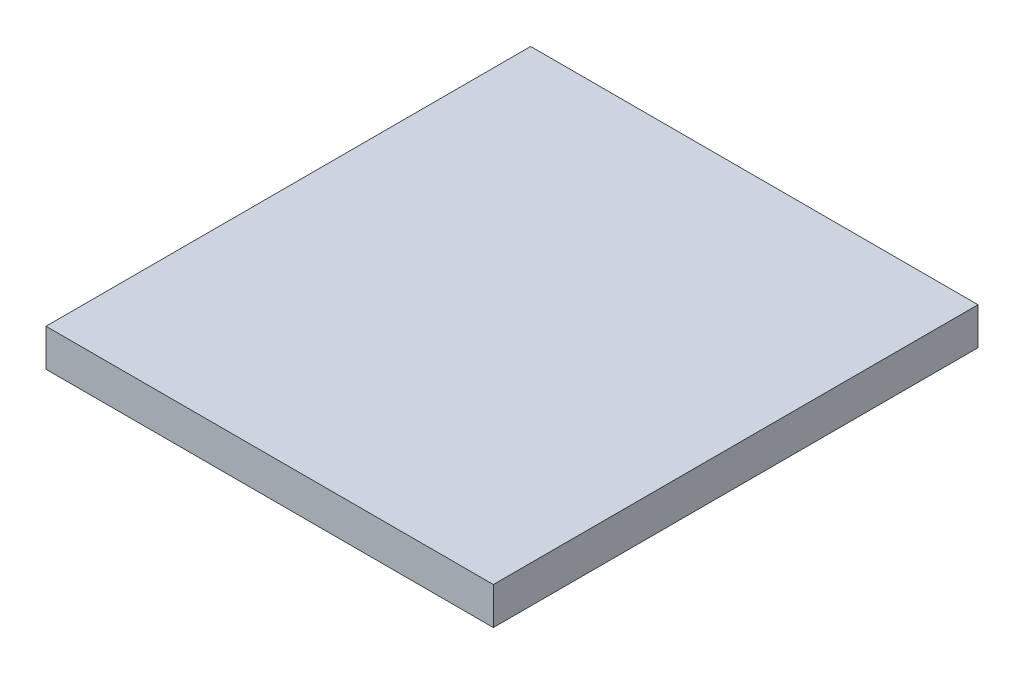
ISO-10303-21;
HEADER;
FILE_DESCRIPTION(('STEP AP214'),'2;1');
FILE_NAME('part.step','',(''),(''),'','','');
FILE_SCHEMA(('AUTOMOTIVE_DESIGN { 1 0 10303 214 1 1 1 1 }'));
ENDSEC;
DATA;
#1=APPLICATION_CONTEXT('core data for automotive mechanical design processes');
#2=APPLICATION_PROTOCOL_DEFINITION('international standard','automotive_design',2000,#1);
#3=PRODUCT_CONTEXT('',#1,'mechanical');
#4=PRODUCT('Part','Part','',(#3));
#5=PRODUCT_RELATED_PRODUCT_CATEGORY('part','',(#4));
#6=PRODUCT_DEFINITION_FORMATION('','',#4);
#7=PRODUCT_DEFINITION_CONTEXT('part definition',#1,'design');
#8=PRODUCT_DEFINITION('design','',#6,#7);
#9=PRODUCT_DEFINITION_SHAPE('','',#8);
#10=(LENGTH_UNIT() NAMED_UNIT(*) SI_UNIT(.MILLI.,.METRE.));
#11=(NAMED_UNIT(*) PLANE_ANGLE_UNIT() SI_UNIT($,.RADIAN.));
#12=(NAMED_UNIT(*) SI_UNIT($,.STERADIAN.) SOLID_ANGLE_UNIT());
#13=UNCERTAINTY_MEASURE_WITH_UNIT(LENGTH_MEASURE(1.E-05),#10,'distance_accuracy_value','');
#14=(GEOMETRIC_REPRESENTATION_CONTEXT(3) GLOBAL_UNCERTAINTY_ASSIGNED_CONTEXT((#13)) GLOBAL_UNIT_ASSIGNED_CONTEXT((#10,
#11,#12)) REPRESENTATION_CONTEXT('',''));
#15=CARTESIAN_POINT('',(0.,0.,0.));
#16=DIRECTION('',(0.,0.,1.));
#17=DIRECTION('',(1.,0.,0.));
#18=AXIS2_PLACEMENT_3D('',#15,#16,#17);
#19=CARTESIAN_POINT('',(-30.,30.,-90.));
#20=DIRECTION('',(-1.,0.,0.));
#21=DIRECTION('',(0.,0.,1.));
#22=AXIS2_PLACEMENT_3D('',#19,#20,#21);
#23=PLANE('',#22);
#24=DIRECTION('',(0.,-1.,0.));
#25=VECTOR('',#24,1.);
#26=CARTESIAN_POINT('',(-30.,30.,-25.));
#27=LINE('',#26,#25);
#28=CARTESIAN_POINT('',(-30.,35.,-25.));
#29=VERTEX_POINT('',#28);
#30=CARTESIAN_POINT('',(-30.,30.,-25.));
#31=VERTEX_POINT('',#30);
#32=EDGE_CURVE('E103',#29,#31,#27,.T.);
#33=ORIENTED_EDGE('',*,*,#32,.F.);
#34=DIRECTION('',(0.,0.,1.));
#35=VECTOR('',#34,1.);
#36=CARTESIAN_POINT('',(-30.,35.,-90.));
#37=LINE('',#36,#35);
#38=CARTESIAN_POINT('',(-30.,35.,-90.));
#39=VERTEX_POINT('',#38);
#40=EDGE_CURVE('E11',#39,#29,#37,.T.);
#41=ORIENTED_EDGE('',*,*,#40,.F.);
#42=DIRECTION('',(0.,-1.,0.));
#43=VECTOR('',#42,1.);
#44=CARTESIAN_POINT('',(-30.,30.,-90.));
#45=LINE('',#44,#43);
#46=CARTESIAN_POINT('',(-30.,30.,-90.));
#47=VERTEX_POINT('',#46);
#48=EDGE_CURVE('E97',#39,#47,#45,.T.);
#49=ORIENTED_EDGE('',*,*,#48,.T.);
#50=DIRECTION('',(0.,0.,1.));
#51=VECTOR('',#50,1.);
#52=CARTESIAN_POINT('',(-30.,30.,-90.));
#53=LINE('',#52,#51);
#54=EDGE_CURVE('E42',#47,#31,#53,.T.);
#55=ORIENTED_EDGE('',*,*,#54,.T.);
#56=EDGE_LOOP('',(#33,#41,#49,#55));
#57=FACE_BOUND('',#56,.T.);
#58=ADVANCED_FACE('F39',(#57),#23,.T.);
#59=CARTESIAN_POINT('',(-30.,35.,-90.));
#60=DIRECTION('',(0.,1.,0.));
#61=DIRECTION('',(0.,0.,1.));
#62=AXIS2_PLACEMENT_3D('',#59,#60,#61);
#63=PLANE('',#62);
#64=DIRECTION('',(-1.,0.,0.));
#65=VECTOR('',#64,1.);
#66=CARTESIAN_POINT('',(-30.,35.,-25.));
#67=LINE('',#66,#65);
#68=CARTESIAN_POINT('',(30.,35.,-25.));
#69=VERTEX_POINT('',#68);
#70=EDGE_CURVE('E99',#69,#29,#67,.T.);
#71=ORIENTED_EDGE('',*,*,#70,.F.);
#72=DIRECTION('',(0.,0.,1.));
#73=VECTOR('',#72,1.);
#74=CARTESIAN_POINT('',(30.,35.,-90.));
#75=LINE('',#74,#73);
#76=CARTESIAN_POINT('',(30.,35.,-90.));
#77=VERTEX_POINT('',#76);
#78=EDGE_CURVE('E48',#77,#69,#75,.T.);
#79=ORIENTED_EDGE('',*,*,#78,.F.);
#80=DIRECTION('',(-1.,0.,0.));
#81=VECTOR('',#80,1.);
#82=CARTESIAN_POINT('',(-30.,35.,-90.));
#83=LINE('',#82,#81);
#84=EDGE_CURVE('E94',#77,#39,#83,.T.);
#85=ORIENTED_EDGE('',*,*,#84,.T.);
#86=ORIENTED_EDGE('',*,*,#40,.T.);
#87=EDGE_LOOP('',(#71,#79,#85,#86));
#88=FACE_BOUND('',#87,.T.);
#89=ADVANCED_FACE('F113',(#88),#63,.T.);
#90=CARTESIAN_POINT('',(30.,30.,-90.));
#91=DIRECTION('',(1.,0.,0.));
#92=DIRECTION('',(0.,0.,-1.));
#93=AXIS2_PLACEMENT_3D('',#90,#91,#92);
#94=PLANE('',#93);
#95=DIRECTION('',(0.,1.,0.));
#96=VECTOR('',#95,1.);
#97=CARTESIAN_POINT('',(30.,30.,-25.));
#98=LINE('',#97,#96);
#99=CARTESIAN_POINT('',(30.,30.,-25.));
#100=VERTEX_POINT('',#99);
#101=EDGE_CURVE('E89',#100,#69,#98,.T.);
#102=ORIENTED_EDGE('',*,*,#101,.F.);
#103=DIRECTION('',(0.,0.,1.));
#104=VECTOR('',#103,1.);
#105=CARTESIAN_POINT('',(30.,30.,-90.));
#106=LINE('',#105,#104);
#107=CARTESIAN_POINT('',(30.,30.,-90.));
#108=VERTEX_POINT('',#107);
#109=EDGE_CURVE('E84',#108,#100,#106,.T.);
#110=ORIENTED_EDGE('',*,*,#109,.F.);
#111=DIRECTION('',(0.,1.,0.));
#112=VECTOR('',#111,1.);
#113=CARTESIAN_POINT('',(30.,30.,-90.));
#114=LINE('',#113,#112);
#115=EDGE_CURVE('E87',#108,#77,#114,.T.);
#116=ORIENTED_EDGE('',*,*,#115,.T.);
#117=ORIENTED_EDGE('',*,*,#78,.T.);
#118=EDGE_LOOP('',(#102,#110,#116,#117));
#119=FACE_BOUND('',#118,.T.);
#120=ADVANCED_FACE('F86',(#119),#94,.T.);
#121=CARTESIAN_POINT('',(-30.,30.,-90.));
#122=DIRECTION('',(0.,-1.,0.));
#123=DIRECTION('',(0.,0.,-1.));
#124=AXIS2_PLACEMENT_3D('',#121,#122,#123);
#125=PLANE('',#124);
#126=DIRECTION('',(1.,0.,0.));
#127=VECTOR('',#126,1.);
#128=CARTESIAN_POINT('',(-30.,30.,-25.));
#129=LINE('',#128,#127);
#130=EDGE_CURVE('E106',#31,#100,#129,.T.);
#131=ORIENTED_EDGE('',*,*,#130,.F.);
#132=ORIENTED_EDGE('',*,*,#54,.F.);
#133=DIRECTION('',(1.,0.,0.));
#134=VECTOR('',#133,1.);
#135=CARTESIAN_POINT('',(-30.,30.,-90.));
#136=LINE('',#135,#134);
#137=EDGE_CURVE('E93',#47,#108,#136,.T.);
#138=ORIENTED_EDGE('',*,*,#137,.T.);
#139=ORIENTED_EDGE('',*,*,#109,.T.);
#140=EDGE_LOOP('',(#131,#132,#138,#139));
#141=FACE_BOUND('',#140,.T.);
#142=ADVANCED_FACE('F96',(#141),#125,.T.);
#143=CARTESIAN_POINT('',(0.,0.,-90.));
#144=DIRECTION('',(0.,0.,-1.));
#145=DIRECTION('',(-1.,0.,0.));
#146=AXIS2_PLACEMENT_3D('',#143,#144,#145);
#147=PLANE('',#146);
#148=ORIENTED_EDGE('',*,*,#48,.F.);
#149=ORIENTED_EDGE('',*,*,#84,.F.);
#150=ORIENTED_EDGE('',*,*,#115,.F.);
#151=ORIENTED_EDGE('',*,*,#137,.F.);
#152=EDGE_LOOP('',(#148,#149,#150,#151));
#153=FACE_BOUND('',#152,.T.);
#154=ADVANCED_FACE('F92',(#153),#147,.T.);
#155=CARTESIAN_POINT('',(0.,0.,-25.));
#156=DIRECTION('',(0.,0.,-1.));
#157=DIRECTION('',(-1.,0.,0.));
#158=AXIS2_PLACEMENT_3D('',#155,#156,#157);
#159=PLANE('',#158);
#160=ORIENTED_EDGE('',*,*,#32,.T.);
#161=ORIENTED_EDGE('',*,*,#130,.T.);
#162=ORIENTED_EDGE('',*,*,#101,.T.);
#163=ORIENTED_EDGE('',*,*,#70,.T.);
#164=EDGE_LOOP('',(#160,#161,#162,#163));
#165=FACE_BOUND('',#164,.T.);
#166=ADVANCED_FACE('F112',(#165),#159,.F.);
#167=CLOSED_SHELL('',(#58,#89,#120,#142,#154,#166));
#168=MANIFOLD_SOLID_BREP('B2',#167);
#169=ADVANCED_BREP_SHAPE_REPRESENTATION('',(#18,#168),#14);
#170=SHAPE_DEFINITION_REPRESENTATION(#9,#169);
ENDSEC;
END-ISO-10303-21;
